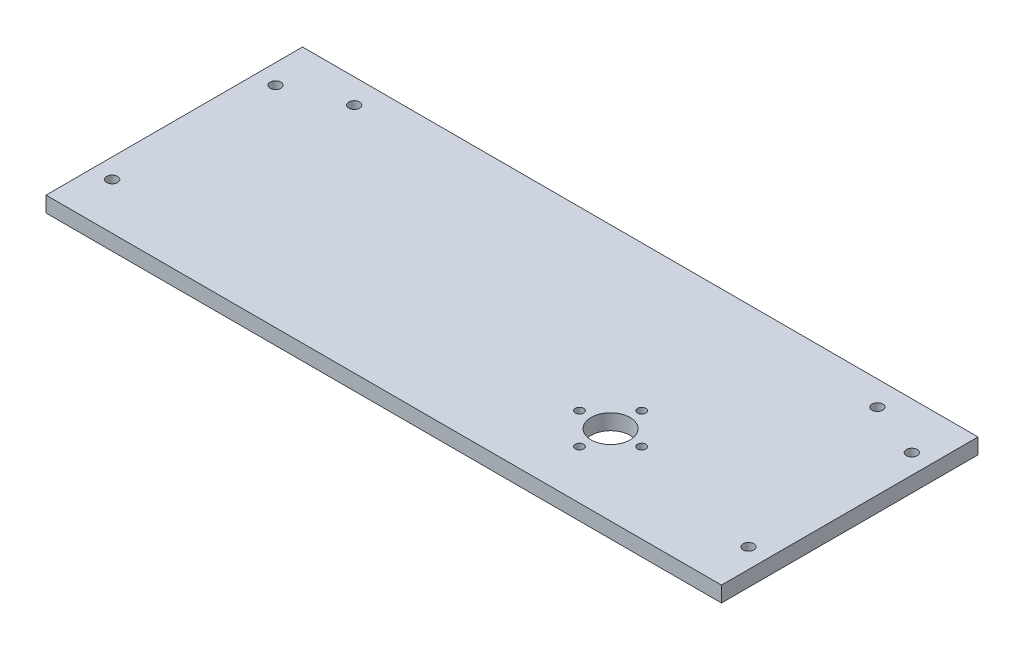
ISO-10303-21;
HEADER;
FILE_DESCRIPTION(('STEP AP214'),'2;1');
FILE_NAME('part.step','',(''),(''),'','','');
FILE_SCHEMA(('AUTOMOTIVE_DESIGN { 1 0 10303 214 1 1 1 1 }'));
ENDSEC;
DATA;
#1=APPLICATION_CONTEXT('core data for automotive mechanical design processes');
#2=APPLICATION_PROTOCOL_DEFINITION('international standard','automotive_design',2000,#1);
#3=PRODUCT_CONTEXT('',#1,'mechanical');
#4=PRODUCT('Part','Part','',(#3));
#5=PRODUCT_RELATED_PRODUCT_CATEGORY('part','',(#4));
#6=PRODUCT_DEFINITION_FORMATION('','',#4);
#7=PRODUCT_DEFINITION_CONTEXT('part definition',#1,'design');
#8=PRODUCT_DEFINITION('design','',#6,#7);
#9=PRODUCT_DEFINITION_SHAPE('','',#8);
#10=(LENGTH_UNIT() NAMED_UNIT(*) SI_UNIT(.MILLI.,.METRE.));
#11=(NAMED_UNIT(*) PLANE_ANGLE_UNIT() SI_UNIT($,.RADIAN.));
#12=(NAMED_UNIT(*) SI_UNIT($,.STERADIAN.) SOLID_ANGLE_UNIT());
#13=UNCERTAINTY_MEASURE_WITH_UNIT(LENGTH_MEASURE(1.E-05),#10,'distance_accuracy_value','');
#14=(GEOMETRIC_REPRESENTATION_CONTEXT(3) GLOBAL_UNCERTAINTY_ASSIGNED_CONTEXT((#13)) GLOBAL_UNIT_ASSIGNED_CONTEXT((#10,
#11,#12)) REPRESENTATION_CONTEXT('',''));
#15=CARTESIAN_POINT('',(0.,0.,0.));
#16=DIRECTION('',(0.,0.,1.));
#17=DIRECTION('',(1.,0.,0.));
#18=AXIS2_PLACEMENT_3D('',#15,#16,#17);
#19=CARTESIAN_POINT('',(138.,6.35,-52.413000043));
#20=DIRECTION('',(-1.,0.,0.));
#21=DIRECTION('',(0.,0.,1.));
#22=AXIS2_PLACEMENT_3D('',#19,#20,#21);
#23=PLANE('',#22);
#24=DIRECTION('',(0.,0.,-1.));
#25=VECTOR('',#24,1.);
#26=CARTESIAN_POINT('',(138.,0.,-52.413000043));
#27=LINE('',#26,#25);
#28=CARTESIAN_POINT('',(138.,0.,52.413000043));
#29=VERTEX_POINT('',#28);
#30=CARTESIAN_POINT('',(138.,0.,-52.413000043));
#31=VERTEX_POINT('',#30);
#32=EDGE_CURVE('E110',#29,#31,#27,.T.);
#33=ORIENTED_EDGE('',*,*,#32,.T.);
#34=DIRECTION('',(0.,-1.,0.));
#35=VECTOR('',#34,1.);
#36=CARTESIAN_POINT('',(138.,6.35,-52.413000043));
#37=LINE('',#36,#35);
#38=CARTESIAN_POINT('',(138.,6.35,-52.413000043));
#39=VERTEX_POINT('',#38);
#40=EDGE_CURVE('E11',#39,#31,#37,.T.);
#41=ORIENTED_EDGE('',*,*,#40,.F.);
#42=DIRECTION('',(0.,0.,-1.));
#43=VECTOR('',#42,1.);
#44=CARTESIAN_POINT('',(138.,6.35,-52.413000043));
#45=LINE('',#44,#43);
#46=CARTESIAN_POINT('',(138.,6.35,52.413000043));
#47=VERTEX_POINT('',#46);
#48=EDGE_CURVE('E94',#47,#39,#45,.T.);
#49=ORIENTED_EDGE('',*,*,#48,.F.);
#50=DIRECTION('',(0.,-1.,0.));
#51=VECTOR('',#50,1.);
#52=CARTESIAN_POINT('',(138.,6.35,52.413000043));
#53=LINE('',#52,#51);
#54=EDGE_CURVE('E106',#47,#29,#53,.T.);
#55=ORIENTED_EDGE('',*,*,#54,.T.);
#56=EDGE_LOOP('',(#33,#41,#49,#55));
#57=FACE_BOUND('',#56,.T.);
#58=ADVANCED_FACE('F42',(#57),#23,.F.);
#59=CARTESIAN_POINT('',(-138.,6.35,-52.413000043));
#60=DIRECTION('',(0.,0.,1.));
#61=DIRECTION('',(1.,0.,0.));
#62=AXIS2_PLACEMENT_3D('',#59,#60,#61);
#63=PLANE('',#62);
#64=DIRECTION('',(-1.,0.,0.));
#65=VECTOR('',#64,1.);
#66=CARTESIAN_POINT('',(-138.,0.,-52.413000043));
#67=LINE('',#66,#65);
#68=CARTESIAN_POINT('',(-138.,0.,-52.413000043));
#69=VERTEX_POINT('',#68);
#70=EDGE_CURVE('E99',#31,#69,#67,.T.);
#71=ORIENTED_EDGE('',*,*,#70,.T.);
#72=DIRECTION('',(0.,-1.,0.));
#73=VECTOR('',#72,1.);
#74=CARTESIAN_POINT('',(-138.,6.35,-52.413000043));
#75=LINE('',#74,#73);
#76=CARTESIAN_POINT('',(-138.,6.35,-52.413000043));
#77=VERTEX_POINT('',#76);
#78=EDGE_CURVE('E51',#77,#69,#75,.T.);
#79=ORIENTED_EDGE('',*,*,#78,.F.);
#80=DIRECTION('',(-1.,0.,0.));
#81=VECTOR('',#80,1.);
#82=CARTESIAN_POINT('',(-138.,6.35,-52.413000043));
#83=LINE('',#82,#81);
#84=EDGE_CURVE('E89',#39,#77,#83,.T.);
#85=ORIENTED_EDGE('',*,*,#84,.F.);
#86=ORIENTED_EDGE('',*,*,#40,.T.);
#87=EDGE_LOOP('',(#71,#79,#85,#86));
#88=FACE_BOUND('',#87,.T.);
#89=ADVANCED_FACE('F98',(#88),#63,.F.);
#90=CARTESIAN_POINT('',(-138.,6.35,-52.413000043));
#91=DIRECTION('',(1.,0.,0.));
#92=DIRECTION('',(0.,0.,-1.));
#93=AXIS2_PLACEMENT_3D('',#90,#91,#92);
#94=PLANE('',#93);
#95=DIRECTION('',(0.,0.,1.));
#96=VECTOR('',#95,1.);
#97=CARTESIAN_POINT('',(-138.,0.,-52.413000043));
#98=LINE('',#97,#96);
#99=CARTESIAN_POINT('',(-138.,0.,52.413000043));
#100=VERTEX_POINT('',#99);
#101=EDGE_CURVE('E76',#69,#100,#98,.T.);
#102=ORIENTED_EDGE('',*,*,#101,.T.);
#103=DIRECTION('',(0.,-1.,0.));
#104=VECTOR('',#103,1.);
#105=CARTESIAN_POINT('',(-138.,6.35,52.413000043));
#106=LINE('',#105,#104);
#107=CARTESIAN_POINT('',(-138.,6.35,52.413000043));
#108=VERTEX_POINT('',#107);
#109=EDGE_CURVE('E101',#108,#100,#106,.T.);
#110=ORIENTED_EDGE('',*,*,#109,.F.);
#111=DIRECTION('',(0.,0.,1.));
#112=VECTOR('',#111,1.);
#113=CARTESIAN_POINT('',(-138.,6.35,-52.413000043));
#114=LINE('',#113,#112);
#115=EDGE_CURVE('E92',#77,#108,#114,.T.);
#116=ORIENTED_EDGE('',*,*,#115,.F.);
#117=ORIENTED_EDGE('',*,*,#78,.T.);
#118=EDGE_LOOP('',(#102,#110,#116,#117));
#119=FACE_BOUND('',#118,.T.);
#120=ADVANCED_FACE('F102',(#119),#94,.F.);
#121=CARTESIAN_POINT('',(-138.,6.35,52.413000043));
#122=DIRECTION('',(0.,0.,-1.));
#123=DIRECTION('',(-1.,0.,0.));
#124=AXIS2_PLACEMENT_3D('',#121,#122,#123);
#125=PLANE('',#124);
#126=DIRECTION('',(1.,0.,0.));
#127=VECTOR('',#126,1.);
#128=CARTESIAN_POINT('',(-138.,0.,52.413000043));
#129=LINE('',#128,#127);
#130=EDGE_CURVE('E82',#100,#29,#129,.T.);
#131=ORIENTED_EDGE('',*,*,#130,.T.);
#132=ORIENTED_EDGE('',*,*,#54,.F.);
#133=DIRECTION('',(1.,0.,0.));
#134=VECTOR('',#133,1.);
#135=CARTESIAN_POINT('',(-138.,6.35,52.413000043));
#136=LINE('',#135,#134);
#137=EDGE_CURVE('E59',#108,#47,#136,.T.);
#138=ORIENTED_EDGE('',*,*,#137,.F.);
#139=ORIENTED_EDGE('',*,*,#109,.T.);
#140=EDGE_LOOP('',(#131,#132,#138,#139));
#141=FACE_BOUND('',#140,.T.);
#142=ADVANCED_FACE('F124',(#141),#125,.F.);
#143=CARTESIAN_POINT('',(0.,6.35,0.));
#144=DIRECTION('',(0.,1.,0.));
#145=DIRECTION('',(0.,0.,1.));
#146=AXIS2_PLACEMENT_3D('',#143,#144,#145);
#147=PLANE('',#146);
#148=CARTESIAN_POINT('',(60.,6.35,7.018000155));
#149=DIRECTION('',(0.,1.,0.));
#150=DIRECTION('',(0.,0.,1.));
#151=AXIS2_PLACEMENT_3D('',#148,#149,#150);
#152=CIRCLE('',#151,1.7);
#153=CARTESIAN_POINT('',(60.,6.35,8.718000155));
#154=VERTEX_POINT('',#153);
#155=EDGE_CURVE('E208',#154,#154,#152,.T.);
#156=ORIENTED_EDGE('',*,*,#155,.F.);
#157=EDGE_LOOP('',(#156));
#158=FACE_BOUND('',#157,.T.);
#159=CARTESIAN_POINT('',(72.7,6.35,19.718000155));
#160=DIRECTION('',(0.,1.,0.));
#161=DIRECTION('',(0.,0.,1.));
#162=AXIS2_PLACEMENT_3D('',#159,#160,#161);
#163=CIRCLE('',#162,1.7);
#164=CARTESIAN_POINT('',(72.7,6.35,21.418000155));
#165=VERTEX_POINT('',#164);
#166=EDGE_CURVE('E204',#165,#165,#163,.T.);
#167=ORIENTED_EDGE('',*,*,#166,.F.);
#168=EDGE_LOOP('',(#167));
#169=FACE_BOUND('',#168,.T.);
#170=CARTESIAN_POINT('',(60.,6.35,32.418000155));
#171=DIRECTION('',(0.,1.,0.));
#172=DIRECTION('',(0.,0.,1.));
#173=AXIS2_PLACEMENT_3D('',#170,#171,#172);
#174=CIRCLE('',#173,1.70000000000001);
#175=CARTESIAN_POINT('',(60.,6.35,34.118000155));
#176=VERTEX_POINT('',#175);
#177=EDGE_CURVE('E196',#176,#176,#174,.T.);
#178=ORIENTED_EDGE('',*,*,#177,.F.);
#179=EDGE_LOOP('',(#178));
#180=FACE_BOUND('',#179,.T.);
#181=CARTESIAN_POINT('',(47.3,6.35,19.718000155));
#182=DIRECTION('',(0.,1.,0.));
#183=DIRECTION('',(0.,0.,1.));
#184=AXIS2_PLACEMENT_3D('',#181,#182,#183);
#185=CIRCLE('',#184,1.69999999999999);
#186=CARTESIAN_POINT('',(47.3,6.35,21.418000155));
#187=VERTEX_POINT('',#186);
#188=EDGE_CURVE('E187',#187,#187,#185,.T.);
#189=ORIENTED_EDGE('',*,*,#188,.F.);
#190=EDGE_LOOP('',(#189));
#191=FACE_BOUND('',#190,.T.);
#192=CARTESIAN_POINT('',(60.,6.35,19.718000155));
#193=DIRECTION('',(0.,1.,0.));
#194=DIRECTION('',(0.,0.,1.));
#195=AXIS2_PLACEMENT_3D('',#192,#193,#194);
#196=CIRCLE('',#195,7.9629);
#197=CARTESIAN_POINT('',(60.,6.35,27.680900155));
#198=VERTEX_POINT('',#197);
#199=EDGE_CURVE('E182',#198,#198,#196,.T.);
#200=ORIENTED_EDGE('',*,*,#199,.F.);
#201=EDGE_LOOP('',(#200));
#202=FACE_BOUND('',#201,.T.);
#203=CARTESIAN_POINT('',(-106.885,6.35,-42.413000043));
#204=DIRECTION('',(0.,1.,0.));
#205=DIRECTION('',(0.,0.,1.));
#206=AXIS2_PLACEMENT_3D('',#203,#204,#205);
#207=CIRCLE('',#206,2.20000000000001);
#208=CARTESIAN_POINT('',(-106.885,6.35,-40.213000043));
#209=VERTEX_POINT('',#208);
#210=EDGE_CURVE('E167',#209,#209,#207,.T.);
#211=ORIENTED_EDGE('',*,*,#210,.F.);
#212=EDGE_LOOP('',(#211));
#213=FACE_BOUND('',#212,.T.);
#214=CARTESIAN_POINT('',(106.885,6.35,-42.413000043));
#215=DIRECTION('',(0.,1.,0.));
#216=DIRECTION('',(0.,0.,1.));
#217=AXIS2_PLACEMENT_3D('',#214,#215,#216);
#218=CIRCLE('',#217,2.20000000000001);
#219=CARTESIAN_POINT('',(106.885,6.35,-40.213000043));
#220=VERTEX_POINT('',#219);
#221=EDGE_CURVE('E163',#220,#220,#218,.T.);
#222=ORIENTED_EDGE('',*,*,#221,.F.);
#223=EDGE_LOOP('',(#222));
#224=FACE_BOUND('',#223,.T.);
#225=CARTESIAN_POINT('',(130.,6.35,-33.363000043));
#226=DIRECTION('',(0.,1.,0.));
#227=DIRECTION('',(0.,0.,-1.));
#228=AXIS2_PLACEMENT_3D('',#225,#226,#227);
#229=CIRCLE('',#228,2.20000000000001);
#230=CARTESIAN_POINT('',(130.,6.35,-35.563000043));
#231=VERTEX_POINT('',#230);
#232=EDGE_CURVE('E139',#231,#231,#229,.T.);
#233=ORIENTED_EDGE('',*,*,#232,.F.);
#234=EDGE_LOOP('',(#233));
#235=FACE_BOUND('',#234,.T.);
#236=CARTESIAN_POINT('',(130.,6.35,33.363000043));
#237=DIRECTION('',(0.,1.,0.));
#238=DIRECTION('',(0.,0.,-1.));
#239=AXIS2_PLACEMENT_3D('',#236,#237,#238);
#240=CIRCLE('',#239,2.20000000000001);
#241=CARTESIAN_POINT('',(130.,6.35,31.163000043));
#242=VERTEX_POINT('',#241);
#243=EDGE_CURVE('E149',#242,#242,#240,.T.);
#244=ORIENTED_EDGE('',*,*,#243,.F.);
#245=EDGE_LOOP('',(#244));
#246=FACE_BOUND('',#245,.T.);
#247=CARTESIAN_POINT('',(-130.,6.35,33.363000043));
#248=DIRECTION('',(0.,1.,0.));
#249=DIRECTION('',(0.,0.,1.));
#250=AXIS2_PLACEMENT_3D('',#247,#248,#249);
#251=CIRCLE('',#250,2.20000000000001);
#252=CARTESIAN_POINT('',(-130.,6.35,35.563000043));
#253=VERTEX_POINT('',#252);
#254=EDGE_CURVE('E138',#253,#253,#251,.T.);
#255=ORIENTED_EDGE('',*,*,#254,.F.);
#256=EDGE_LOOP('',(#255));
#257=FACE_BOUND('',#256,.T.);
#258=CARTESIAN_POINT('',(-130.,6.35,-33.363000043));
#259=DIRECTION('',(0.,1.,0.));
#260=DIRECTION('',(0.,0.,1.));
#261=AXIS2_PLACEMENT_3D('',#258,#259,#260);
#262=CIRCLE('',#261,2.20000000000001);
#263=CARTESIAN_POINT('',(-130.,6.35,-31.163000043));
#264=VERTEX_POINT('',#263);
#265=EDGE_CURVE('E134',#264,#264,#262,.T.);
#266=ORIENTED_EDGE('',*,*,#265,.F.);
#267=EDGE_LOOP('',(#266));
#268=FACE_BOUND('',#267,.T.);
#269=ORIENTED_EDGE('',*,*,#48,.T.);
#270=ORIENTED_EDGE('',*,*,#84,.T.);
#271=ORIENTED_EDGE('',*,*,#115,.T.);
#272=ORIENTED_EDGE('',*,*,#137,.T.);
#273=EDGE_LOOP('',(#269,#270,#271,#272));
#274=FACE_BOUND('',#273,.T.);
#275=ADVANCED_FACE('F90',(#158,#169,#180,#191,#202,#213,#224,#235,#246,#257,#268,#274),#147,.T.);
#276=CARTESIAN_POINT('',(0.,0.,0.));
#277=DIRECTION('',(0.,1.,0.));
#278=DIRECTION('',(0.,0.,1.));
#279=AXIS2_PLACEMENT_3D('',#276,#277,#278);
#280=PLANE('',#279);
#281=CARTESIAN_POINT('',(60.,0.,7.018000155));
#282=DIRECTION('',(0.,1.,0.));
#283=DIRECTION('',(0.,0.,1.));
#284=AXIS2_PLACEMENT_3D('',#281,#282,#283);
#285=CIRCLE('',#284,1.7);
#286=CARTESIAN_POINT('',(60.,0.,8.718000155));
#287=VERTEX_POINT('',#286);
#288=EDGE_CURVE('E186',#287,#287,#285,.F.);
#289=ORIENTED_EDGE('',*,*,#288,.F.);
#290=EDGE_LOOP('',(#289));
#291=FACE_BOUND('',#290,.T.);
#292=CARTESIAN_POINT('',(72.7,0.,19.718000155));
#293=DIRECTION('',(0.,1.,0.));
#294=DIRECTION('',(0.,0.,1.));
#295=AXIS2_PLACEMENT_3D('',#292,#293,#294);
#296=CIRCLE('',#295,1.7);
#297=CARTESIAN_POINT('',(72.7,0.,21.418000155));
#298=VERTEX_POINT('',#297);
#299=EDGE_CURVE('E200',#298,#298,#296,.F.);
#300=ORIENTED_EDGE('',*,*,#299,.F.);
#301=EDGE_LOOP('',(#300));
#302=FACE_BOUND('',#301,.T.);
#303=CARTESIAN_POINT('',(60.,0.,32.418000155));
#304=DIRECTION('',(0.,1.,0.));
#305=DIRECTION('',(0.,0.,1.));
#306=AXIS2_PLACEMENT_3D('',#303,#304,#305);
#307=CIRCLE('',#306,1.70000000000001);
#308=CARTESIAN_POINT('',(60.,0.,34.118000155));
#309=VERTEX_POINT('',#308);
#310=EDGE_CURVE('E191',#309,#309,#307,.F.);
#311=ORIENTED_EDGE('',*,*,#310,.F.);
#312=EDGE_LOOP('',(#311));
#313=FACE_BOUND('',#312,.T.);
#314=CARTESIAN_POINT('',(47.3,0.,19.718000155));
#315=DIRECTION('',(0.,1.,0.));
#316=DIRECTION('',(0.,0.,1.));
#317=AXIS2_PLACEMENT_3D('',#314,#315,#316);
#318=CIRCLE('',#317,1.69999999999999);
#319=CARTESIAN_POINT('',(47.3,0.,21.418000155));
#320=VERTEX_POINT('',#319);
#321=EDGE_CURVE('E192',#320,#320,#318,.F.);
#322=ORIENTED_EDGE('',*,*,#321,.F.);
#323=EDGE_LOOP('',(#322));
#324=FACE_BOUND('',#323,.T.);
#325=CARTESIAN_POINT('',(60.,0.,19.718000155));
#326=DIRECTION('',(0.,1.,0.));
#327=DIRECTION('',(0.,0.,1.));
#328=AXIS2_PLACEMENT_3D('',#325,#326,#327);
#329=CIRCLE('',#328,7.9629);
#330=CARTESIAN_POINT('',(60.,0.,27.680900155));
#331=VERTEX_POINT('',#330);
#332=EDGE_CURVE('E172',#331,#331,#329,.F.);
#333=ORIENTED_EDGE('',*,*,#332,.F.);
#334=EDGE_LOOP('',(#333));
#335=FACE_BOUND('',#334,.T.);
#336=CARTESIAN_POINT('',(-106.885,0.,-42.413000043));
#337=DIRECTION('',(0.,1.,0.));
#338=DIRECTION('',(0.,0.,1.));
#339=AXIS2_PLACEMENT_3D('',#336,#337,#338);
#340=CIRCLE('',#339,2.20000000000001);
#341=CARTESIAN_POINT('',(-106.885,0.,-40.213000043));
#342=VERTEX_POINT('',#341);
#343=EDGE_CURVE('E148',#342,#342,#340,.F.);
#344=ORIENTED_EDGE('',*,*,#343,.F.);
#345=EDGE_LOOP('',(#344));
#346=FACE_BOUND('',#345,.T.);
#347=CARTESIAN_POINT('',(106.885,0.,-42.413000043));
#348=DIRECTION('',(0.,1.,0.));
#349=DIRECTION('',(0.,0.,1.));
#350=AXIS2_PLACEMENT_3D('',#347,#348,#349);
#351=CIRCLE('',#350,2.20000000000001);
#352=CARTESIAN_POINT('',(106.885,0.,-40.213000043));
#353=VERTEX_POINT('',#352);
#354=EDGE_CURVE('E168',#353,#353,#351,.F.);
#355=ORIENTED_EDGE('',*,*,#354,.F.);
#356=EDGE_LOOP('',(#355));
#357=FACE_BOUND('',#356,.T.);
#358=CARTESIAN_POINT('',(130.,0.,-33.363000043));
#359=DIRECTION('',(0.,1.,0.));
#360=DIRECTION('',(0.,0.,1.));
#361=AXIS2_PLACEMENT_3D('',#358,#359,#360);
#362=CIRCLE('',#361,2.20000000000001);
#363=CARTESIAN_POINT('',(130.,0.,-31.163000043));
#364=VERTEX_POINT('',#363);
#365=EDGE_CURVE('E144',#364,#364,#362,.F.);
#366=ORIENTED_EDGE('',*,*,#365,.F.);
#367=EDGE_LOOP('',(#366));
#368=FACE_BOUND('',#367,.T.);
#369=CARTESIAN_POINT('',(130.,0.,33.363000043));
#370=DIRECTION('',(0.,1.,0.));
#371=DIRECTION('',(0.,0.,1.));
#372=AXIS2_PLACEMENT_3D('',#369,#370,#371);
#373=CIRCLE('',#372,2.20000000000001);
#374=CARTESIAN_POINT('',(130.,0.,35.563000043));
#375=VERTEX_POINT('',#374);
#376=EDGE_CURVE('E143',#375,#375,#373,.F.);
#377=ORIENTED_EDGE('',*,*,#376,.F.);
#378=EDGE_LOOP('',(#377));
#379=FACE_BOUND('',#378,.T.);
#380=CARTESIAN_POINT('',(-130.,0.,33.363000043));
#381=DIRECTION('',(0.,1.,0.));
#382=DIRECTION('',(0.,0.,1.));
#383=AXIS2_PLACEMENT_3D('',#380,#381,#382);
#384=CIRCLE('',#383,2.20000000000001);
#385=CARTESIAN_POINT('',(-130.,0.,35.563000043));
#386=VERTEX_POINT('',#385);
#387=EDGE_CURVE('E153',#386,#386,#384,.F.);
#388=ORIENTED_EDGE('',*,*,#387,.F.);
#389=EDGE_LOOP('',(#388));
#390=FACE_BOUND('',#389,.T.);
#391=CARTESIAN_POINT('',(-130.,0.,-33.363000043));
#392=DIRECTION('',(0.,1.,0.));
#393=DIRECTION('',(0.,0.,1.));
#394=AXIS2_PLACEMENT_3D('',#391,#392,#393);
#395=CIRCLE('',#394,2.20000000000001);
#396=CARTESIAN_POINT('',(-130.,0.,-31.163000043));
#397=VERTEX_POINT('',#396);
#398=EDGE_CURVE('E114',#397,#397,#395,.F.);
#399=ORIENTED_EDGE('',*,*,#398,.F.);
#400=EDGE_LOOP('',(#399));
#401=FACE_BOUND('',#400,.T.);
#402=ORIENTED_EDGE('',*,*,#32,.F.);
#403=ORIENTED_EDGE('',*,*,#130,.F.);
#404=ORIENTED_EDGE('',*,*,#101,.F.);
#405=ORIENTED_EDGE('',*,*,#70,.F.);
#406=EDGE_LOOP('',(#402,#403,#404,#405));
#407=FACE_BOUND('',#406,.T.);
#408=ADVANCED_FACE('F127',(#291,#302,#313,#324,#335,#346,#357,#368,#379,#390,#401,#407),#280,.F.);
#409=CARTESIAN_POINT('',(-130.,-0.00100000000000013,-33.363000043));
#410=DIRECTION('',(0.,1.,0.));
#411=DIRECTION('',(0.,0.,1.));
#412=AXIS2_PLACEMENT_3D('',#409,#410,#411);
#413=CYLINDRICAL_SURFACE('',#412,2.20000000000001);
#414=ORIENTED_EDGE('',*,*,#265,.T.);
#415=EDGE_LOOP('',(#414));
#416=FACE_BOUND('',#415,.T.);
#417=ORIENTED_EDGE('',*,*,#398,.T.);
#418=EDGE_LOOP('',(#417));
#419=FACE_BOUND('',#418,.T.);
#420=ADVANCED_FACE('F245',(#416,#419),#413,.F.);
#421=CARTESIAN_POINT('',(-130.,-0.00100000000000013,33.363000043));
#422=DIRECTION('',(0.,1.,0.));
#423=DIRECTION('',(0.,0.,1.));
#424=AXIS2_PLACEMENT_3D('',#421,#422,#423);
#425=CYLINDRICAL_SURFACE('',#424,2.20000000000001);
#426=ORIENTED_EDGE('',*,*,#254,.T.);
#427=EDGE_LOOP('',(#426));
#428=FACE_BOUND('',#427,.T.);
#429=ORIENTED_EDGE('',*,*,#387,.T.);
#430=EDGE_LOOP('',(#429));
#431=FACE_BOUND('',#430,.T.);
#432=ADVANCED_FACE('F248',(#428,#431),#425,.F.);
#433=CARTESIAN_POINT('',(130.,-0.00100000000000013,33.363000043));
#434=DIRECTION('',(0.,1.,0.));
#435=DIRECTION('',(0.,0.,1.));
#436=AXIS2_PLACEMENT_3D('',#433,#434,#435);
#437=CYLINDRICAL_SURFACE('',#436,2.20000000000001);
#438=ORIENTED_EDGE('',*,*,#243,.T.);
#439=EDGE_LOOP('',(#438));
#440=FACE_BOUND('',#439,.T.);
#441=ORIENTED_EDGE('',*,*,#376,.T.);
#442=EDGE_LOOP('',(#441));
#443=FACE_BOUND('',#442,.T.);
#444=ADVANCED_FACE('F297',(#440,#443),#437,.F.);
#445=CARTESIAN_POINT('',(130.,-0.00100000000000013,-33.363000043));
#446=DIRECTION('',(0.,1.,0.));
#447=DIRECTION('',(0.,0.,1.));
#448=AXIS2_PLACEMENT_3D('',#445,#446,#447);
#449=CYLINDRICAL_SURFACE('',#448,2.20000000000001);
#450=ORIENTED_EDGE('',*,*,#232,.T.);
#451=EDGE_LOOP('',(#450));
#452=FACE_BOUND('',#451,.T.);
#453=ORIENTED_EDGE('',*,*,#365,.T.);
#454=EDGE_LOOP('',(#453));
#455=FACE_BOUND('',#454,.T.);
#456=ADVANCED_FACE('F305',(#452,#455),#449,.F.);
#457=CARTESIAN_POINT('',(106.885,-0.00100000000000013,-42.413000043));
#458=DIRECTION('',(0.,1.,0.));
#459=DIRECTION('',(0.,0.,1.));
#460=AXIS2_PLACEMENT_3D('',#457,#458,#459);
#461=CYLINDRICAL_SURFACE('',#460,2.20000000000001);
#462=ORIENTED_EDGE('',*,*,#221,.T.);
#463=EDGE_LOOP('',(#462));
#464=FACE_BOUND('',#463,.T.);
#465=ORIENTED_EDGE('',*,*,#354,.T.);
#466=EDGE_LOOP('',(#465));
#467=FACE_BOUND('',#466,.T.);
#468=ADVANCED_FACE('F313',(#464,#467),#461,.F.);
#469=CARTESIAN_POINT('',(-106.885,-0.00100000000000013,-42.413000043));
#470=DIRECTION('',(0.,1.,0.));
#471=DIRECTION('',(0.,0.,1.));
#472=AXIS2_PLACEMENT_3D('',#469,#470,#471);
#473=CYLINDRICAL_SURFACE('',#472,2.20000000000001);
#474=ORIENTED_EDGE('',*,*,#210,.T.);
#475=EDGE_LOOP('',(#474));
#476=FACE_BOUND('',#475,.T.);
#477=ORIENTED_EDGE('',*,*,#343,.T.);
#478=EDGE_LOOP('',(#477));
#479=FACE_BOUND('',#478,.T.);
#480=ADVANCED_FACE('F321',(#476,#479),#473,.F.);
#481=CARTESIAN_POINT('',(60.,-0.00100000000000013,19.718000155));
#482=DIRECTION('',(0.,1.,0.));
#483=DIRECTION('',(0.,0.,1.));
#484=AXIS2_PLACEMENT_3D('',#481,#482,#483);
#485=CYLINDRICAL_SURFACE('',#484,7.9629);
#486=ORIENTED_EDGE('',*,*,#199,.T.);
#487=EDGE_LOOP('',(#486));
#488=FACE_BOUND('',#487,.T.);
#489=ORIENTED_EDGE('',*,*,#332,.T.);
#490=EDGE_LOOP('',(#489));
#491=FACE_BOUND('',#490,.T.);
#492=ADVANCED_FACE('F329',(#488,#491),#485,.F.);
#493=CARTESIAN_POINT('',(47.3,-0.00100000000000013,19.718000155));
#494=DIRECTION('',(0.,1.,0.));
#495=DIRECTION('',(0.,0.,1.));
#496=AXIS2_PLACEMENT_3D('',#493,#494,#495);
#497=CYLINDRICAL_SURFACE('',#496,1.69999999999999);
#498=ORIENTED_EDGE('',*,*,#188,.T.);
#499=EDGE_LOOP('',(#498));
#500=FACE_BOUND('',#499,.T.);
#501=ORIENTED_EDGE('',*,*,#321,.T.);
#502=EDGE_LOOP('',(#501));
#503=FACE_BOUND('',#502,.T.);
#504=ADVANCED_FACE('F336',(#500,#503),#497,.F.);
#505=CARTESIAN_POINT('',(60.,-0.00100000000000013,32.418000155));
#506=DIRECTION('',(0.,1.,0.));
#507=DIRECTION('',(0.,0.,1.));
#508=AXIS2_PLACEMENT_3D('',#505,#506,#507);
#509=CYLINDRICAL_SURFACE('',#508,1.70000000000001);
#510=ORIENTED_EDGE('',*,*,#177,.T.);
#511=EDGE_LOOP('',(#510));
#512=FACE_BOUND('',#511,.T.);
#513=ORIENTED_EDGE('',*,*,#310,.T.);
#514=EDGE_LOOP('',(#513));
#515=FACE_BOUND('',#514,.T.);
#516=ADVANCED_FACE('F343',(#512,#515),#509,.F.);
#517=CARTESIAN_POINT('',(72.7,-0.00100000000000013,19.718000155));
#518=DIRECTION('',(0.,1.,0.));
#519=DIRECTION('',(0.,0.,1.));
#520=AXIS2_PLACEMENT_3D('',#517,#518,#519);
#521=CYLINDRICAL_SURFACE('',#520,1.7);
#522=ORIENTED_EDGE('',*,*,#166,.T.);
#523=EDGE_LOOP('',(#522));
#524=FACE_BOUND('',#523,.T.);
#525=ORIENTED_EDGE('',*,*,#299,.T.);
#526=EDGE_LOOP('',(#525));
#527=FACE_BOUND('',#526,.T.);
#528=ADVANCED_FACE('F351',(#524,#527),#521,.F.);
#529=CARTESIAN_POINT('',(60.,-0.00100000000000013,7.018000155));
#530=DIRECTION('',(0.,1.,0.));
#531=DIRECTION('',(0.,0.,1.));
#532=AXIS2_PLACEMENT_3D('',#529,#530,#531);
#533=CYLINDRICAL_SURFACE('',#532,1.7);
#534=ORIENTED_EDGE('',*,*,#155,.T.);
#535=EDGE_LOOP('',(#534));
#536=FACE_BOUND('',#535,.T.);
#537=ORIENTED_EDGE('',*,*,#288,.T.);
#538=EDGE_LOOP('',(#537));
#539=FACE_BOUND('',#538,.T.);
#540=ADVANCED_FACE('F219',(#536,#539),#533,.F.);
#541=CLOSED_SHELL('',(#58,#89,#120,#142,#275,#408,#420,#432,#444,#456,#468,#480,#492,#504,#516,
#528,#540));
#542=MANIFOLD_SOLID_BREP('B2',#541);
#543=ADVANCED_BREP_SHAPE_REPRESENTATION('',(#18,#542),#14);
#544=SHAPE_DEFINITION_REPRESENTATION(#9,#543);
ENDSEC;
END-ISO-10303-21;
